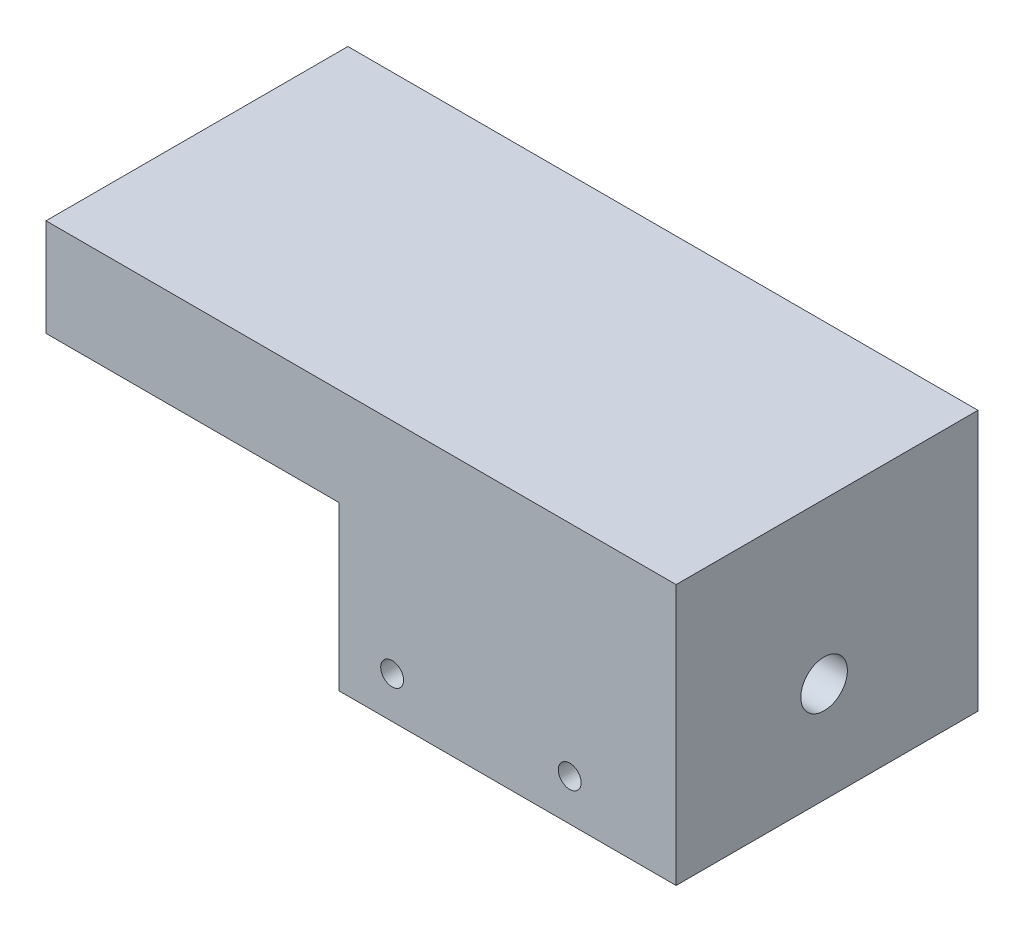
ISO-10303-21;
HEADER;
FILE_DESCRIPTION(('STEP AP214'),'2;1');
FILE_NAME('part.step','',(''),(''),'','','');
FILE_SCHEMA(('AUTOMOTIVE_DESIGN { 1 0 10303 214 1 1 1 1 }'));
ENDSEC;
DATA;
#1=APPLICATION_CONTEXT('core data for automotive mechanical design processes');
#2=APPLICATION_PROTOCOL_DEFINITION('international standard','automotive_design',2000,#1);
#3=PRODUCT_CONTEXT('',#1,'mechanical');
#4=PRODUCT('Part','Part','',(#3));
#5=PRODUCT_RELATED_PRODUCT_CATEGORY('part','',(#4));
#6=PRODUCT_DEFINITION_FORMATION('','',#4);
#7=PRODUCT_DEFINITION_CONTEXT('part definition',#1,'design');
#8=PRODUCT_DEFINITION('design','',#6,#7);
#9=PRODUCT_DEFINITION_SHAPE('','',#8);
#10=(LENGTH_UNIT() NAMED_UNIT(*) SI_UNIT(.MILLI.,.METRE.));
#11=(NAMED_UNIT(*) PLANE_ANGLE_UNIT() SI_UNIT($,.RADIAN.));
#12=(NAMED_UNIT(*) SI_UNIT($,.STERADIAN.) SOLID_ANGLE_UNIT());
#13=UNCERTAINTY_MEASURE_WITH_UNIT(LENGTH_MEASURE(1.E-05),#10,'distance_accuracy_value','');
#14=(GEOMETRIC_REPRESENTATION_CONTEXT(3) GLOBAL_UNCERTAINTY_ASSIGNED_CONTEXT((#13)) GLOBAL_UNIT_ASSIGNED_CONTEXT((#10,
#11,#12)) REPRESENTATION_CONTEXT('',''));
#15=CARTESIAN_POINT('',(0.,0.,0.));
#16=DIRECTION('',(0.,0.,1.));
#17=DIRECTION('',(1.,0.,0.));
#18=AXIS2_PLACEMENT_3D('',#15,#16,#17);
#19=CARTESIAN_POINT('',(48.,-5.616325,33.1917878));
#20=DIRECTION('',(0.,-1.,0.));
#21=DIRECTION('',(0.,0.,1.));
#22=AXIS2_PLACEMENT_3D('',#19,#20,#21);
#23=PLANE('',#22);
#24=DIRECTION('',(0.,0.,-1.));
#25=VECTOR('',#24,1.);
#26=CARTESIAN_POINT('',(12.2681524629967,-5.616325,123.470216823141));
#27=LINE('',#26,#25);
#28=CARTESIAN_POINT('',(12.2681524629967,-5.61632499999988,79.1917878));
#29=VERTEX_POINT('',#28);
#30=CARTESIAN_POINT('',(12.2681524629967,-5.61632499999988,55.1917878));
#31=VERTEX_POINT('',#30);
#32=EDGE_CURVE('E115',#29,#31,#27,.T.);
#33=ORIENTED_EDGE('',*,*,#32,.F.);
#34=DIRECTION('',(1.,0.,0.));
#35=VECTOR('',#34,1.);
#36=CARTESIAN_POINT('',(12.2681524629967,-5.616325,79.1917878));
#37=LINE('',#36,#35);
#38=CARTESIAN_POINT('',(35.7318475370033,-5.616325,79.1917878));
#39=VERTEX_POINT('',#38);
#40=EDGE_CURVE('E103',#29,#39,#37,.T.);
#41=ORIENTED_EDGE('',*,*,#40,.T.);
#42=DIRECTION('',(0.,0.,-1.));
#43=VECTOR('',#42,1.);
#44=CARTESIAN_POINT('',(35.7318475370033,-5.616325,123.470216823141));
#45=LINE('',#44,#43);
#46=CARTESIAN_POINT('',(35.7318475370033,-5.61632499999977,55.1917878));
#47=VERTEX_POINT('',#46);
#48=EDGE_CURVE('E113',#39,#47,#45,.T.);
#49=ORIENTED_EDGE('',*,*,#48,.T.);
#50=DIRECTION('',(-1.,0.,0.));
#51=VECTOR('',#50,1.);
#52=CARTESIAN_POINT('',(12.2681524629967,-5.616325,55.1917878));
#53=LINE('',#52,#51);
#54=EDGE_CURVE('E131',#47,#31,#53,.T.);
#55=ORIENTED_EDGE('',*,*,#54,.T.);
#56=EDGE_LOOP('',(#33,#41,#49,#55));
#57=FACE_BOUND('',#56,.T.);
#58=DIRECTION('',(0.,0.,1.));
#59=VECTOR('',#58,1.);
#60=CARTESIAN_POINT('',(49.5,-5.616325,33.1917878));
#61=LINE('',#60,#59);
#62=CARTESIAN_POINT('',(49.5,-5.616325,33.1917878));
#63=VERTEX_POINT('',#62);
#64=CARTESIAN_POINT('',(49.5,-5.616325,84.1917878));
#65=VERTEX_POINT('',#64);
#66=EDGE_CURVE('E132',#63,#65,#61,.T.);
#67=ORIENTED_EDGE('',*,*,#66,.T.);
#68=DIRECTION('',(1.,0.,0.));
#69=VECTOR('',#68,1.);
#70=CARTESIAN_POINT('',(-17.2191805697573,-5.616325,84.1917878));
#71=LINE('',#70,#69);
#72=CARTESIAN_POINT('',(0.,-5.616325,84.1917878));
#73=VERTEX_POINT('',#72);
#74=EDGE_CURVE('E185',#73,#65,#71,.T.);
#75=ORIENTED_EDGE('',*,*,#74,.F.);
#76=DIRECTION('',(0.,0.,1.));
#77=VECTOR('',#76,1.);
#78=CARTESIAN_POINT('',(0.,-5.616325,33.1917878));
#79=LINE('',#78,#77);
#80=CARTESIAN_POINT('',(0.,-5.616325,33.1917878));
#81=VERTEX_POINT('',#80);
#82=EDGE_CURVE('E181',#81,#73,#79,.T.);
#83=ORIENTED_EDGE('',*,*,#82,.F.);
#84=DIRECTION('',(-1.,0.,0.));
#85=VECTOR('',#84,1.);
#86=CARTESIAN_POINT('',(49.5,-5.616325,33.1917878));
#87=LINE('',#86,#85);
#88=EDGE_CURVE('E139',#63,#81,#87,.T.);
#89=ORIENTED_EDGE('',*,*,#88,.F.);
#90=EDGE_LOOP('',(#67,#75,#83,#89));
#91=FACE_BOUND('',#90,.T.);
#92=ADVANCED_FACE('F32',(#57,#91),#23,.T.);
#93=CARTESIAN_POINT('',(0.,-8.166325,0.));
#94=DIRECTION('',(0.,1.,0.));
#95=DIRECTION('',(0.,0.,1.));
#96=AXIS2_PLACEMENT_3D('',#93,#94,#95);
#97=PLANE('',#96);
#98=DIRECTION('',(0.,0.,-1.));
#99=VECTOR('',#98,1.);
#100=CARTESIAN_POINT('',(49.5,-8.166325,-60.3469004731473));
#101=LINE('',#100,#99);
#102=CARTESIAN_POINT('',(49.5,-8.166325,76.1917878));
#103=VERTEX_POINT('',#102);
#104=CARTESIAN_POINT('',(49.5,-8.166325,33.1917878));
#105=VERTEX_POINT('',#104);
#106=EDGE_CURVE('E77',#103,#105,#101,.T.);
#107=ORIENTED_EDGE('',*,*,#106,.T.);
#108=DIRECTION('',(1.,0.,0.));
#109=VECTOR('',#108,1.);
#110=CARTESIAN_POINT('',(0.,-8.166325,33.1917878));
#111=LINE('',#110,#109);
#112=CARTESIAN_POINT('',(97.45,-8.166325,33.1917878));
#113=VERTEX_POINT('',#112);
#114=EDGE_CURVE('E134',#105,#113,#111,.T.);
#115=ORIENTED_EDGE('',*,*,#114,.T.);
#116=DIRECTION('',(0.,0.,-1.));
#117=VECTOR('',#116,1.);
#118=CARTESIAN_POINT('',(97.45,-8.166325,-9.80821219999999));
#119=LINE('',#118,#117);
#120=CARTESIAN_POINT('',(97.45,-8.166325,76.1917878));
#121=VERTEX_POINT('',#120);
#122=EDGE_CURVE('E194',#121,#113,#119,.T.);
#123=ORIENTED_EDGE('',*,*,#122,.F.);
#124=DIRECTION('',(-1.,0.,0.));
#125=VECTOR('',#124,1.);
#126=CARTESIAN_POINT('',(49.5,-8.166325,76.1917878));
#127=LINE('',#126,#125);
#128=EDGE_CURVE('E184',#121,#103,#127,.T.);
#129=ORIENTED_EDGE('',*,*,#128,.T.);
#130=EDGE_LOOP('',(#107,#115,#123,#129));
#131=FACE_BOUND('',#130,.T.);
#132=ADVANCED_FACE('F261',(#131),#97,.F.);
#133=CARTESIAN_POINT('',(0.,0.,10.));
#134=DIRECTION('',(1.,0.,0.));
#135=DIRECTION('',(0.,0.,-1.));
#136=AXIS2_PLACEMENT_3D('',#133,#134,#135);
#137=PLANE('',#136);
#138=DIRECTION('',(0.,1.,0.));
#139=VECTOR('',#138,1.);
#140=CARTESIAN_POINT('',(0.,10.8609375,33.1917878));
#141=LINE('',#140,#139);
#142=CARTESIAN_POINT('',(0.,10.8609375,33.1917878));
#143=VERTEX_POINT('',#142);
#144=EDGE_CURVE('E196',#81,#143,#141,.T.);
#145=ORIENTED_EDGE('',*,*,#144,.F.);
#146=ORIENTED_EDGE('',*,*,#82,.T.);
#147=DIRECTION('',(0.,1.,0.));
#148=VECTOR('',#147,1.);
#149=CARTESIAN_POINT('',(0.,10.8609375,84.1917878));
#150=LINE('',#149,#148);
#151=CARTESIAN_POINT('',(0.,10.8609375,84.1917878));
#152=VERTEX_POINT('',#151);
#153=EDGE_CURVE('E178',#73,#152,#150,.T.);
#154=ORIENTED_EDGE('',*,*,#153,.T.);
#155=DIRECTION('',(0.,0.,-1.));
#156=VECTOR('',#155,1.);
#157=CARTESIAN_POINT('',(0.,10.8609375,82.405200233796));
#158=LINE('',#157,#156);
#159=EDGE_CURVE('E164',#152,#143,#158,.T.);
#160=ORIENTED_EDGE('',*,*,#159,.T.);
#161=EDGE_LOOP('',(#145,#146,#154,#160));
#162=FACE_BOUND('',#161,.T.);
#163=ADVANCED_FACE('F267',(#162),#137,.F.);
#164=CARTESIAN_POINT('',(0.,10.8609375,82.405200233796));
#165=DIRECTION('',(0.,-1.,0.));
#166=DIRECTION('',(0.,0.,-1.));
#167=AXIS2_PLACEMENT_3D('',#164,#165,#166);
#168=PLANE('',#167);
#169=DIRECTION('',(0.,0.,1.));
#170=VECTOR('',#169,1.);
#171=CARTESIAN_POINT('',(106.45,10.8609375,33.1917878));
#172=LINE('',#171,#170);
#173=CARTESIAN_POINT('',(106.45,10.8609375,33.1917878));
#174=VERTEX_POINT('',#173);
#175=CARTESIAN_POINT('',(106.45,10.8609375,84.1917878));
#176=VERTEX_POINT('',#175);
#177=EDGE_CURVE('E153',#174,#176,#172,.T.);
#178=ORIENTED_EDGE('',*,*,#177,.F.);
#179=DIRECTION('',(-1.,0.,0.));
#180=VECTOR('',#179,1.);
#181=CARTESIAN_POINT('',(106.45,10.8609375,33.1917878));
#182=LINE('',#181,#180);
#183=EDGE_CURVE('E156',#174,#143,#182,.T.);
#184=ORIENTED_EDGE('',*,*,#183,.T.);
#185=ORIENTED_EDGE('',*,*,#159,.F.);
#186=DIRECTION('',(1.,0.,0.));
#187=VECTOR('',#186,1.);
#188=CARTESIAN_POINT('',(-17.2191805697573,10.8609375,84.1917878));
#189=LINE('',#188,#187);
#190=EDGE_CURVE('E149',#152,#176,#189,.T.);
#191=ORIENTED_EDGE('',*,*,#190,.T.);
#192=EDGE_LOOP('',(#178,#184,#185,#191));
#193=FACE_BOUND('',#192,.T.);
#194=ADVANCED_FACE('F409',(#193),#168,.F.);
#195=CARTESIAN_POINT('',(106.45,0.,0.));
#196=DIRECTION('',(-1.,0.,0.));
#197=DIRECTION('',(0.,0.,1.));
#198=AXIS2_PLACEMENT_3D('',#195,#196,#197);
#199=PLANE('',#198);
#200=CARTESIAN_POINT('',(106.45,-16.166325,59.1917878));
#201=DIRECTION('',(-1.,0.,0.));
#202=DIRECTION('',(0.,0.,1.));
#203=AXIS2_PLACEMENT_3D('',#200,#201,#202);
#204=CIRCLE('',#203,3.93700000000001);
#205=CARTESIAN_POINT('',(106.45,-16.166325,63.1287878));
#206=VERTEX_POINT('',#205);
#207=EDGE_CURVE('E146',#206,#206,#204,.T.);
#208=ORIENTED_EDGE('',*,*,#207,.T.);
#209=EDGE_LOOP('',(#208));
#210=FACE_BOUND('',#209,.T.);
#211=DIRECTION('',(0.,0.,1.));
#212=VECTOR('',#211,1.);
#213=CARTESIAN_POINT('',(106.45,-33.166325,-17.8082122));
#214=LINE('',#213,#212);
#215=CARTESIAN_POINT('',(106.45,-33.166325,33.1917878));
#216=VERTEX_POINT('',#215);
#217=CARTESIAN_POINT('',(106.45,-33.166325,84.1917878));
#218=VERTEX_POINT('',#217);
#219=EDGE_CURVE('E174',#216,#218,#214,.T.);
#220=ORIENTED_EDGE('',*,*,#219,.F.);
#221=DIRECTION('',(0.,1.,0.));
#222=VECTOR('',#221,1.);
#223=CARTESIAN_POINT('',(106.45,10.8609375,33.1917878));
#224=LINE('',#223,#222);
#225=EDGE_CURVE('E148',#216,#174,#224,.T.);
#226=ORIENTED_EDGE('',*,*,#225,.T.);
#227=ORIENTED_EDGE('',*,*,#177,.T.);
#228=DIRECTION('',(0.,1.,0.));
#229=VECTOR('',#228,1.);
#230=CARTESIAN_POINT('',(106.45,-8.166325,84.1917878));
#231=LINE('',#230,#229);
#232=EDGE_CURVE('E168',#218,#176,#231,.T.);
#233=ORIENTED_EDGE('',*,*,#232,.F.);
#234=EDGE_LOOP('',(#220,#226,#227,#233));
#235=FACE_BOUND('',#234,.T.);
#236=ADVANCED_FACE('F400',(#210,#235),#199,.F.);
#237=CARTESIAN_POINT('',(97.45,-33.166325,-9.80821219999999));
#238=DIRECTION('',(1.,0.,0.));
#239=DIRECTION('',(0.,0.,-1.));
#240=AXIS2_PLACEMENT_3D('',#237,#238,#239);
#241=PLANE('',#240);
#242=CARTESIAN_POINT('',(97.45,-16.166325,59.1917878));
#243=DIRECTION('',(-1.,0.,0.));
#244=DIRECTION('',(0.,0.,1.));
#245=AXIS2_PLACEMENT_3D('',#242,#243,#244);
#246=CIRCLE('',#245,3.93700000000001);
#247=CARTESIAN_POINT('',(97.45,-16.166325,63.1287878));
#248=VERTEX_POINT('',#247);
#249=EDGE_CURVE('E126',#248,#248,#246,.T.);
#250=ORIENTED_EDGE('',*,*,#249,.F.);
#251=EDGE_LOOP('',(#250));
#252=FACE_BOUND('',#251,.T.);
#253=ORIENTED_EDGE('',*,*,#122,.T.);
#254=DIRECTION('',(0.,-1.,0.));
#255=VECTOR('',#254,1.);
#256=CARTESIAN_POINT('',(97.45,-33.166325,33.1917878));
#257=LINE('',#256,#255);
#258=CARTESIAN_POINT('',(97.45,-33.166325,33.1917878));
#259=VERTEX_POINT('',#258);
#260=EDGE_CURVE('E191',#113,#259,#257,.T.);
#261=ORIENTED_EDGE('',*,*,#260,.T.);
#262=DIRECTION('',(0.,0.,-1.));
#263=VECTOR('',#262,1.);
#264=CARTESIAN_POINT('',(97.45,-33.166325,-9.80821219999999));
#265=LINE('',#264,#263);
#266=CARTESIAN_POINT('',(97.45,-33.166325,76.1917878));
#267=VERTEX_POINT('',#266);
#268=EDGE_CURVE('E222',#267,#259,#265,.T.);
#269=ORIENTED_EDGE('',*,*,#268,.F.);
#270=DIRECTION('',(0.,1.,0.));
#271=VECTOR('',#270,1.);
#272=CARTESIAN_POINT('',(97.45,-33.166325,76.1917878));
#273=LINE('',#272,#271);
#274=EDGE_CURVE('E193',#267,#121,#273,.T.);
#275=ORIENTED_EDGE('',*,*,#274,.T.);
#276=EDGE_LOOP('',(#253,#261,#269,#275));
#277=FACE_BOUND('',#276,.T.);
#278=ADVANCED_FACE('F391',(#252,#277),#241,.F.);
#279=CARTESIAN_POINT('',(0.,-33.166325,0.));
#280=DIRECTION('',(0.,1.,0.));
#281=DIRECTION('',(0.,0.,1.));
#282=AXIS2_PLACEMENT_3D('',#279,#280,#281);
#283=PLANE('',#282);
#284=ORIENTED_EDGE('',*,*,#268,.T.);
#285=DIRECTION('',(1.,0.,0.));
#286=VECTOR('',#285,1.);
#287=CARTESIAN_POINT('',(0.,-33.166325,33.1917878));
#288=LINE('',#287,#286);
#289=EDGE_CURVE('E220',#259,#216,#288,.T.);
#290=ORIENTED_EDGE('',*,*,#289,.T.);
#291=ORIENTED_EDGE('',*,*,#219,.T.);
#292=DIRECTION('',(1.,0.,0.));
#293=VECTOR('',#292,1.);
#294=CARTESIAN_POINT('',(49.5,-33.166325,84.1917878));
#295=LINE('',#294,#293);
#296=CARTESIAN_POINT('',(49.5,-33.166325,84.1917878));
#297=VERTEX_POINT('',#296);
#298=EDGE_CURVE('E187',#297,#218,#295,.T.);
#299=ORIENTED_EDGE('',*,*,#298,.F.);
#300=DIRECTION('',(0.,0.,1.));
#301=VECTOR('',#300,1.);
#302=CARTESIAN_POINT('',(49.5,-33.166325,84.1917878));
#303=LINE('',#302,#301);
#304=CARTESIAN_POINT('',(49.5,-33.166325,76.1917878));
#305=VERTEX_POINT('',#304);
#306=EDGE_CURVE('E198',#305,#297,#303,.T.);
#307=ORIENTED_EDGE('',*,*,#306,.F.);
#308=DIRECTION('',(-1.,0.,0.));
#309=VECTOR('',#308,1.);
#310=CARTESIAN_POINT('',(49.5,-33.166325,76.1917878));
#311=LINE('',#310,#309);
#312=EDGE_CURVE('E206',#267,#305,#311,.T.);
#313=ORIENTED_EDGE('',*,*,#312,.F.);
#314=EDGE_LOOP('',(#284,#290,#291,#299,#307,#313));
#315=FACE_BOUND('',#314,.T.);
#316=ADVANCED_FACE('F257',(#315),#283,.F.);
#317=CARTESIAN_POINT('',(88.475,-26.166325,84.1917878));
#318=DIRECTION('',(0.,0.,-1.));
#319=DIRECTION('',(1.,0.,0.));
#320=AXIS2_PLACEMENT_3D('',#317,#318,#319);
#321=CYLINDRICAL_SURFACE('',#320,1.9304);
#322=CARTESIAN_POINT('',(88.475,-26.166325,84.1917878));
#323=DIRECTION('',(0.,0.,1.));
#324=DIRECTION('',(1.,0.,0.));
#325=AXIS2_PLACEMENT_3D('',#322,#323,#324);
#326=CIRCLE('',#325,1.9304);
#327=CARTESIAN_POINT('',(90.4054,-26.166325,84.1917878));
#328=VERTEX_POINT('',#327);
#329=EDGE_CURVE('E170',#328,#328,#326,.T.);
#330=ORIENTED_EDGE('',*,*,#329,.T.);
#331=EDGE_LOOP('',(#330));
#332=FACE_BOUND('',#331,.T.);
#333=CARTESIAN_POINT('',(88.475,-26.166325,76.1917878));
#334=DIRECTION('',(0.,0.,1.));
#335=DIRECTION('',(1.,0.,0.));
#336=AXIS2_PLACEMENT_3D('',#333,#334,#335);
#337=CIRCLE('',#336,1.9304);
#338=CARTESIAN_POINT('',(90.4054,-26.166325,76.1917878));
#339=VERTEX_POINT('',#338);
#340=EDGE_CURVE('E238',#339,#339,#337,.T.);
#341=ORIENTED_EDGE('',*,*,#340,.F.);
#342=EDGE_LOOP('',(#341));
#343=FACE_BOUND('',#342,.T.);
#344=ADVANCED_FACE('F248',(#332,#343),#321,.F.);
#345=CARTESIAN_POINT('',(58.475,-26.166325,84.1917878));
#346=DIRECTION('',(0.,0.,-1.));
#347=DIRECTION('',(1.,0.,0.));
#348=AXIS2_PLACEMENT_3D('',#345,#346,#347);
#349=CYLINDRICAL_SURFACE('',#348,1.9304);
#350=CARTESIAN_POINT('',(58.475,-26.166325,84.1917878));
#351=DIRECTION('',(0.,0.,1.));
#352=DIRECTION('',(1.,0.,0.));
#353=AXIS2_PLACEMENT_3D('',#350,#351,#352);
#354=CIRCLE('',#353,1.9304);
#355=CARTESIAN_POINT('',(60.4054,-26.166325,84.1917878));
#356=VERTEX_POINT('',#355);
#357=EDGE_CURVE('E173',#356,#356,#354,.T.);
#358=ORIENTED_EDGE('',*,*,#357,.T.);
#359=EDGE_LOOP('',(#358));
#360=FACE_BOUND('',#359,.T.);
#361=CARTESIAN_POINT('',(58.475,-26.166325,76.1917878));
#362=DIRECTION('',(0.,0.,1.));
#363=DIRECTION('',(1.,0.,0.));
#364=AXIS2_PLACEMENT_3D('',#361,#362,#363);
#365=CIRCLE('',#364,1.9304);
#366=CARTESIAN_POINT('',(60.4054,-26.166325,76.1917878));
#367=VERTEX_POINT('',#366);
#368=EDGE_CURVE('E177',#367,#367,#365,.T.);
#369=ORIENTED_EDGE('',*,*,#368,.F.);
#370=EDGE_LOOP('',(#369));
#371=FACE_BOUND('',#370,.T.);
#372=ADVANCED_FACE('F246',(#360,#371),#349,.F.);
#373=CARTESIAN_POINT('',(49.5,-33.166325,76.1917878));
#374=DIRECTION('',(0.,0.,1.));
#375=DIRECTION('',(-1.,0.,0.));
#376=AXIS2_PLACEMENT_3D('',#373,#374,#375);
#377=PLANE('',#376);
#378=ORIENTED_EDGE('',*,*,#368,.T.);
#379=EDGE_LOOP('',(#378));
#380=FACE_BOUND('',#379,.T.);
#381=ORIENTED_EDGE('',*,*,#340,.T.);
#382=EDGE_LOOP('',(#381));
#383=FACE_BOUND('',#382,.T.);
#384=ORIENTED_EDGE('',*,*,#128,.F.);
#385=ORIENTED_EDGE('',*,*,#274,.F.);
#386=ORIENTED_EDGE('',*,*,#312,.T.);
#387=DIRECTION('',(0.,1.,0.));
#388=VECTOR('',#387,1.);
#389=CARTESIAN_POINT('',(49.5,-33.166325,76.1917878));
#390=LINE('',#389,#388);
#391=EDGE_CURVE('E188',#305,#103,#390,.T.);
#392=ORIENTED_EDGE('',*,*,#391,.T.);
#393=EDGE_LOOP('',(#384,#385,#386,#392));
#394=FACE_BOUND('',#393,.T.);
#395=ADVANCED_FACE('F243',(#380,#383,#394),#377,.F.);
#396=CARTESIAN_POINT('',(-17.2191805697573,10.8609375,84.1917878));
#397=DIRECTION('',(0.,0.,-1.));
#398=DIRECTION('',(0.,-1.,0.));
#399=AXIS2_PLACEMENT_3D('',#396,#397,#398);
#400=PLANE('',#399);
#401=ORIENTED_EDGE('',*,*,#357,.F.);
#402=EDGE_LOOP('',(#401));
#403=FACE_BOUND('',#402,.T.);
#404=ORIENTED_EDGE('',*,*,#329,.F.);
#405=EDGE_LOOP('',(#404));
#406=FACE_BOUND('',#405,.T.);
#407=ORIENTED_EDGE('',*,*,#74,.T.);
#408=DIRECTION('',(0.,1.,0.));
#409=VECTOR('',#408,1.);
#410=CARTESIAN_POINT('',(49.5,-47.916325,84.1917878));
#411=LINE('',#410,#409);
#412=EDGE_CURVE('E145',#297,#65,#411,.T.);
#413=ORIENTED_EDGE('',*,*,#412,.F.);
#414=ORIENTED_EDGE('',*,*,#298,.T.);
#415=ORIENTED_EDGE('',*,*,#232,.T.);
#416=ORIENTED_EDGE('',*,*,#190,.F.);
#417=ORIENTED_EDGE('',*,*,#153,.F.);
#418=EDGE_LOOP('',(#407,#413,#414,#415,#416,#417));
#419=FACE_BOUND('',#418,.T.);
#420=ADVANCED_FACE('F255',(#403,#406,#419),#400,.F.);
#421=CARTESIAN_POINT('',(106.45,10.8609375,33.1917878));
#422=DIRECTION('',(0.,0.,1.));
#423=DIRECTION('',(1.,0.,0.));
#424=AXIS2_PLACEMENT_3D('',#421,#422,#423);
#425=PLANE('',#424);
#426=ORIENTED_EDGE('',*,*,#114,.F.);
#427=DIRECTION('',(0.,1.,0.));
#428=VECTOR('',#427,1.);
#429=CARTESIAN_POINT('',(49.5,10.8609375,33.1917878));
#430=LINE('',#429,#428);
#431=EDGE_CURVE('E212',#105,#63,#430,.T.);
#432=ORIENTED_EDGE('',*,*,#431,.T.);
#433=ORIENTED_EDGE('',*,*,#88,.T.);
#434=ORIENTED_EDGE('',*,*,#144,.T.);
#435=ORIENTED_EDGE('',*,*,#183,.F.);
#436=ORIENTED_EDGE('',*,*,#225,.F.);
#437=ORIENTED_EDGE('',*,*,#289,.F.);
#438=ORIENTED_EDGE('',*,*,#260,.F.);
#439=EDGE_LOOP('',(#426,#432,#433,#434,#435,#436,#437,#438));
#440=FACE_BOUND('',#439,.T.);
#441=ADVANCED_FACE('F272',(#440),#425,.F.);
#442=CARTESIAN_POINT('',(49.5,-47.916325,33.1917878));
#443=DIRECTION('',(1.,0.,0.));
#444=DIRECTION('',(0.,0.,-1.));
#445=AXIS2_PLACEMENT_3D('',#442,#443,#444);
#446=PLANE('',#445);
#447=ORIENTED_EDGE('',*,*,#391,.F.);
#448=ORIENTED_EDGE('',*,*,#306,.T.);
#449=ORIENTED_EDGE('',*,*,#412,.T.);
#450=ORIENTED_EDGE('',*,*,#66,.F.);
#451=ORIENTED_EDGE('',*,*,#431,.F.);
#452=ORIENTED_EDGE('',*,*,#106,.F.);
#453=EDGE_LOOP('',(#447,#448,#449,#450,#451,#452));
#454=FACE_BOUND('',#453,.T.);
#455=ADVANCED_FACE('F275',(#454),#446,.F.);
#456=CARTESIAN_POINT('',(106.45,-16.166325,59.1917878));
#457=DIRECTION('',(-1.,0.,0.));
#458=DIRECTION('',(0.,0.,1.));
#459=AXIS2_PLACEMENT_3D('',#456,#457,#458);
#460=CYLINDRICAL_SURFACE('',#459,3.93700000000001);
#461=ORIENTED_EDGE('',*,*,#207,.F.);
#462=EDGE_LOOP('',(#461));
#463=FACE_BOUND('',#462,.T.);
#464=ORIENTED_EDGE('',*,*,#249,.T.);
#465=EDGE_LOOP('',(#464));
#466=FACE_BOUND('',#465,.T.);
#467=ADVANCED_FACE('F278',(#463,#466),#460,.F.);
#468=CARTESIAN_POINT('',(12.2681524629967,-5.616325,-2.40051541624203));
#469=DIRECTION('',(-1.,0.,0.));
#470=DIRECTION('',(0.,0.,1.));
#471=AXIS2_PLACEMENT_3D('',#468,#469,#470);
#472=PLANE('',#471);
#473=DIRECTION('',(0.,1.,0.));
#474=VECTOR('',#473,1.);
#475=CARTESIAN_POINT('',(12.2681524629967,-5.616325,55.1917878));
#476=LINE('',#475,#474);
#477=CARTESIAN_POINT('',(12.2681524629967,5.8609375,55.1917878));
#478=VERTEX_POINT('',#477);
#479=EDGE_CURVE('E69',#31,#478,#476,.T.);
#480=ORIENTED_EDGE('',*,*,#479,.T.);
#481=DIRECTION('',(0.,0.,1.));
#482=VECTOR('',#481,1.);
#483=CARTESIAN_POINT('',(12.2681524629967,5.8609375,-2.40051541624203));
#484=LINE('',#483,#482);
#485=CARTESIAN_POINT('',(12.2681524629967,5.8609375,79.1917878));
#486=VERTEX_POINT('',#485);
#487=EDGE_CURVE('E65',#478,#486,#484,.T.);
#488=ORIENTED_EDGE('',*,*,#487,.T.);
#489=DIRECTION('',(0.,-1.,0.));
#490=VECTOR('',#489,1.);
#491=CARTESIAN_POINT('',(12.2681524629967,-5.616325,79.1917878));
#492=LINE('',#491,#490);
#493=EDGE_CURVE('E120',#486,#29,#492,.T.);
#494=ORIENTED_EDGE('',*,*,#493,.T.);
#495=ORIENTED_EDGE('',*,*,#32,.T.);
#496=EDGE_LOOP('',(#480,#488,#494,#495));
#497=FACE_BOUND('',#496,.T.);
#498=ADVANCED_FACE('F281',(#497),#472,.F.);
#499=CARTESIAN_POINT('',(35.7318475370033,-5.616325,-2.40051541624203));
#500=DIRECTION('',(1.,0.,0.));
#501=DIRECTION('',(0.,0.,-1.));
#502=AXIS2_PLACEMENT_3D('',#499,#500,#501);
#503=PLANE('',#502);
#504=DIRECTION('',(0.,1.,0.));
#505=VECTOR('',#504,1.);
#506=CARTESIAN_POINT('',(35.7318475370033,-5.616325,79.1917878));
#507=LINE('',#506,#505);
#508=CARTESIAN_POINT('',(35.7318475370033,5.8609375,79.1917878));
#509=VERTEX_POINT('',#508);
#510=EDGE_CURVE('E108',#39,#509,#507,.T.);
#511=ORIENTED_EDGE('',*,*,#510,.T.);
#512=DIRECTION('',(0.,0.,1.));
#513=VECTOR('',#512,1.);
#514=CARTESIAN_POINT('',(35.7318475370033,5.8609375,-2.40051541624203));
#515=LINE('',#514,#513);
#516=CARTESIAN_POINT('',(35.7318475370033,5.8609375,55.1917878));
#517=VERTEX_POINT('',#516);
#518=EDGE_CURVE('E42',#517,#509,#515,.T.);
#519=ORIENTED_EDGE('',*,*,#518,.F.);
#520=DIRECTION('',(0.,-1.,0.));
#521=VECTOR('',#520,1.);
#522=CARTESIAN_POINT('',(35.7318475370033,-5.616325,55.1917878));
#523=LINE('',#522,#521);
#524=EDGE_CURVE('E36',#517,#47,#523,.T.);
#525=ORIENTED_EDGE('',*,*,#524,.T.);
#526=ORIENTED_EDGE('',*,*,#48,.F.);
#527=EDGE_LOOP('',(#511,#519,#525,#526));
#528=FACE_BOUND('',#527,.T.);
#529=ADVANCED_FACE('F109',(#528),#503,.F.);
#530=CARTESIAN_POINT('',(0.,0.,79.1917878));
#531=DIRECTION('',(0.,0.,1.));
#532=DIRECTION('',(1.,0.,0.));
#533=AXIS2_PLACEMENT_3D('',#530,#531,#532);
#534=PLANE('',#533);
#535=ORIENTED_EDGE('',*,*,#510,.F.);
#536=ORIENTED_EDGE('',*,*,#40,.F.);
#537=ORIENTED_EDGE('',*,*,#493,.F.);
#538=DIRECTION('',(-1.,0.,0.));
#539=VECTOR('',#538,1.);
#540=CARTESIAN_POINT('',(12.2681524629967,5.8609375,79.1917878));
#541=LINE('',#540,#539);
#542=EDGE_CURVE('E11',#509,#486,#541,.T.);
#543=ORIENTED_EDGE('',*,*,#542,.F.);
#544=EDGE_LOOP('',(#535,#536,#537,#543));
#545=FACE_BOUND('',#544,.T.);
#546=ADVANCED_FACE('F119',(#545),#534,.F.);
#547=CARTESIAN_POINT('',(24.,-29.616325,55.1917878));
#548=DIRECTION('',(0.,0.,1.));
#549=DIRECTION('',(1.,0.,0.));
#550=AXIS2_PLACEMENT_3D('',#547,#548,#549);
#551=PLANE('',#550);
#552=ORIENTED_EDGE('',*,*,#524,.F.);
#553=DIRECTION('',(1.,0.,0.));
#554=VECTOR('',#553,1.);
#555=CARTESIAN_POINT('',(12.2681524629967,5.8609375,55.1917878));
#556=LINE('',#555,#554);
#557=EDGE_CURVE('E51',#478,#517,#556,.T.);
#558=ORIENTED_EDGE('',*,*,#557,.F.);
#559=ORIENTED_EDGE('',*,*,#479,.F.);
#560=ORIENTED_EDGE('',*,*,#54,.F.);
#561=EDGE_LOOP('',(#552,#558,#559,#560));
#562=FACE_BOUND('',#561,.T.);
#563=ADVANCED_FACE('F34',(#562),#551,.T.);
#564=CARTESIAN_POINT('',(12.2681524629967,5.8609375,-2.40051541624203));
#565=DIRECTION('',(0.,1.,0.));
#566=DIRECTION('',(0.,0.,1.));
#567=AXIS2_PLACEMENT_3D('',#564,#565,#566);
#568=PLANE('',#567);
#569=ORIENTED_EDGE('',*,*,#557,.T.);
#570=ORIENTED_EDGE('',*,*,#518,.T.);
#571=ORIENTED_EDGE('',*,*,#542,.T.);
#572=ORIENTED_EDGE('',*,*,#487,.F.);
#573=EDGE_LOOP('',(#569,#570,#571,#572));
#574=FACE_BOUND('',#573,.T.);
#575=ADVANCED_FACE('F117',(#574),#568,.F.);
#576=CLOSED_SHELL('',(#92,#132,#163,#194,#236,#278,#316,#344,#372,#395,#420,#441,#455,#467,#498,
#529,#546,#563,#575));
#577=MANIFOLD_SOLID_BREP('B2',#576);
#578=ADVANCED_BREP_SHAPE_REPRESENTATION('',(#18,#577),#14);
#579=SHAPE_DEFINITION_REPRESENTATION(#9,#578);
ENDSEC;
END-ISO-10303-21;
